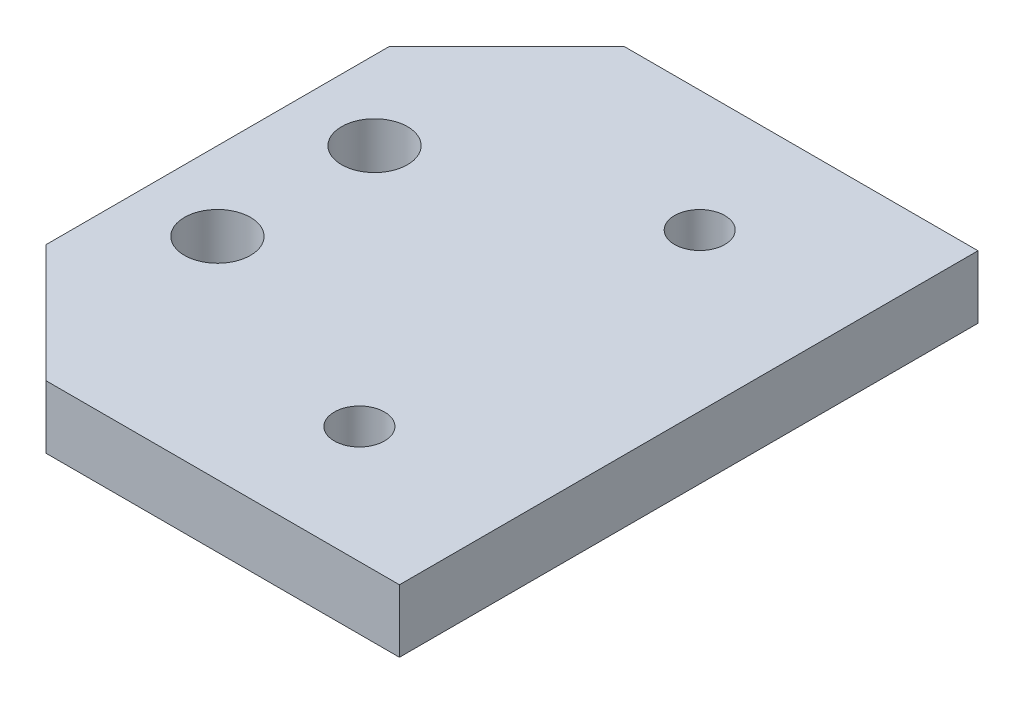
ISO-10303-21;
HEADER;
FILE_DESCRIPTION(('STEP AP214'),'2;1');
FILE_NAME('part.step','',(''),(''),'','','');
FILE_SCHEMA(('AUTOMOTIVE_DESIGN { 1 0 10303 214 1 1 1 1 }'));
ENDSEC;
DATA;
#1=APPLICATION_CONTEXT('core data for automotive mechanical design processes');
#2=APPLICATION_PROTOCOL_DEFINITION('international standard','automotive_design',2000,#1);
#3=PRODUCT_CONTEXT('',#1,'mechanical');
#4=PRODUCT('Part','Part','',(#3));
#5=PRODUCT_RELATED_PRODUCT_CATEGORY('part','',(#4));
#6=PRODUCT_DEFINITION_FORMATION('','',#4);
#7=PRODUCT_DEFINITION_CONTEXT('part definition',#1,'design');
#8=PRODUCT_DEFINITION('design','',#6,#7);
#9=PRODUCT_DEFINITION_SHAPE('','',#8);
#10=(LENGTH_UNIT() NAMED_UNIT(*) SI_UNIT(.MILLI.,.METRE.));
#11=(NAMED_UNIT(*) PLANE_ANGLE_UNIT() SI_UNIT($,.RADIAN.));
#12=(NAMED_UNIT(*) SI_UNIT($,.STERADIAN.) SOLID_ANGLE_UNIT());
#13=UNCERTAINTY_MEASURE_WITH_UNIT(LENGTH_MEASURE(1.E-05),#10,'distance_accuracy_value','');
#14=(GEOMETRIC_REPRESENTATION_CONTEXT(3) GLOBAL_UNCERTAINTY_ASSIGNED_CONTEXT((#13)) GLOBAL_UNIT_ASSIGNED_CONTEXT((#10,
#11,#12)) REPRESENTATION_CONTEXT('',''));
#15=CARTESIAN_POINT('',(0.,0.,0.));
#16=DIRECTION('',(0.,0.,1.));
#17=DIRECTION('',(1.,0.,0.));
#18=AXIS2_PLACEMENT_3D('',#15,#16,#17);
#19=CARTESIAN_POINT('',(0.,4.,0.));
#20=DIRECTION('',(0.,-1.,0.));
#21=DIRECTION('',(0.,0.,1.));
#22=AXIS2_PLACEMENT_3D('',#19,#20,#21);
#23=PLANE('',#22);
#24=CARTESIAN_POINT('',(20.,4.,29.3778251349138));
#25=DIRECTION('',(0.,-1.,0.));
#26=DIRECTION('',(0.,0.,-1.));
#27=AXIS2_PLACEMENT_3D('',#24,#25,#26);
#28=CIRCLE('',#27,1.6);
#29=CARTESIAN_POINT('',(20.,4.,27.7778251349138));
#30=VERTEX_POINT('',#29);
#31=EDGE_CURVE('E166',#30,#30,#28,.T.);
#32=ORIENTED_EDGE('',*,*,#31,.T.);
#33=EDGE_LOOP('',(#32));
#34=FACE_BOUND('',#33,.T.);
#35=CARTESIAN_POINT('',(20.,4.,7.71633932616848));
#36=DIRECTION('',(0.,-1.,0.));
#37=DIRECTION('',(0.,0.,-1.));
#38=AXIS2_PLACEMENT_3D('',#35,#36,#37);
#39=CIRCLE('',#38,1.6);
#40=CARTESIAN_POINT('',(20.,4.,6.11633932616848));
#41=VERTEX_POINT('',#40);
#42=EDGE_CURVE('E163',#41,#41,#39,.T.);
#43=ORIENTED_EDGE('',*,*,#42,.T.);
#44=EDGE_LOOP('',(#43));
#45=FACE_BOUND('',#44,.T.);
#46=DIRECTION('',(-1.,0.,0.));
#47=VECTOR('',#46,1.);
#48=CARTESIAN_POINT('',(0.,4.,36.83));
#49=LINE('',#48,#47);
#50=CARTESIAN_POINT('',(30.,4.,36.83));
#51=VERTEX_POINT('',#50);
#52=CARTESIAN_POINT('',(7.50000000000003,4.,36.83));
#53=VERTEX_POINT('',#52);
#54=EDGE_CURVE('E116',#51,#53,#49,.T.);
#55=ORIENTED_EDGE('',*,*,#54,.F.);
#56=DIRECTION('',(0.,0.,1.));
#57=VECTOR('',#56,1.);
#58=CARTESIAN_POINT('',(30.,4.,0.));
#59=LINE('',#58,#57);
#60=CARTESIAN_POINT('',(30.,4.,0.));
#61=VERTEX_POINT('',#60);
#62=EDGE_CURVE('E99',#61,#51,#59,.T.);
#63=ORIENTED_EDGE('',*,*,#62,.F.);
#64=DIRECTION('',(1.,0.,0.));
#65=VECTOR('',#64,1.);
#66=CARTESIAN_POINT('',(0.,4.,0.));
#67=LINE('',#66,#65);
#68=CARTESIAN_POINT('',(7.50000000000001,4.,0.));
#69=VERTEX_POINT('',#68);
#70=EDGE_CURVE('E108',#69,#61,#67,.T.);
#71=ORIENTED_EDGE('',*,*,#70,.F.);
#72=DIRECTION('',(-0.707106781186547,0.,0.707106781186549));
#73=VECTOR('',#72,1.);
#74=CARTESIAN_POINT('',(7.50000000000001,4.,0.));
#75=LINE('',#74,#73);
#76=CARTESIAN_POINT('',(0.,4.,7.50000000000003));
#77=VERTEX_POINT('',#76);
#78=EDGE_CURVE('E141',#77,#69,#75,.F.);
#79=ORIENTED_EDGE('',*,*,#78,.F.);
#80=DIRECTION('',(0.,0.,-1.));
#81=VECTOR('',#80,1.);
#82=CARTESIAN_POINT('',(0.,4.,0.));
#83=LINE('',#82,#81);
#84=CARTESIAN_POINT('',(0.,4.,29.33));
#85=VERTEX_POINT('',#84);
#86=EDGE_CURVE('E112',#85,#77,#83,.T.);
#87=ORIENTED_EDGE('',*,*,#86,.F.);
#88=DIRECTION('',(0.707106781186549,0.,0.707106781186546));
#89=VECTOR('',#88,1.);
#90=CARTESIAN_POINT('',(0.,4.,29.33));
#91=LINE('',#90,#89);
#92=EDGE_CURVE('E51',#53,#85,#91,.F.);
#93=ORIENTED_EDGE('',*,*,#92,.F.);
#94=EDGE_LOOP('',(#55,#63,#71,#79,#87,#93));
#95=FACE_BOUND('',#94,.T.);
#96=CARTESIAN_POINT('',(5.,4.,23.415));
#97=DIRECTION('',(0.,-1.,0.));
#98=DIRECTION('',(0.,0.,-1.));
#99=AXIS2_PLACEMENT_3D('',#96,#97,#98);
#100=CIRCLE('',#99,2.1);
#101=CARTESIAN_POINT('',(5.,4.,21.315));
#102=VERTEX_POINT('',#101);
#103=EDGE_CURVE('E125',#102,#102,#100,.T.);
#104=ORIENTED_EDGE('',*,*,#103,.T.);
#105=EDGE_LOOP('',(#104));
#106=FACE_BOUND('',#105,.T.);
#107=CARTESIAN_POINT('',(5.,4.,13.415));
#108=DIRECTION('',(0.,-1.,0.));
#109=DIRECTION('',(0.,0.,-1.));
#110=AXIS2_PLACEMENT_3D('',#107,#108,#109);
#111=CIRCLE('',#110,2.1);
#112=CARTESIAN_POINT('',(5.,4.,11.315));
#113=VERTEX_POINT('',#112);
#114=EDGE_CURVE('E151',#113,#113,#111,.T.);
#115=ORIENTED_EDGE('',*,*,#114,.T.);
#116=EDGE_LOOP('',(#115));
#117=FACE_BOUND('',#116,.T.);
#118=ADVANCED_FACE('F43',(#34,#45,#95,#106,#117),#23,.F.);
#119=CARTESIAN_POINT('',(0.,0.,0.));
#120=DIRECTION('',(0.,-1.,0.));
#121=DIRECTION('',(0.,0.,1.));
#122=AXIS2_PLACEMENT_3D('',#119,#120,#121);
#123=PLANE('',#122);
#124=CARTESIAN_POINT('',(20.,0.,29.3778251349138));
#125=DIRECTION('',(0.,-1.,0.));
#126=DIRECTION('',(0.,0.,-1.));
#127=AXIS2_PLACEMENT_3D('',#124,#125,#126);
#128=CIRCLE('',#127,1.6);
#129=CARTESIAN_POINT('',(20.,0.,27.7778251349138));
#130=VERTEX_POINT('',#129);
#131=EDGE_CURVE('E157',#130,#130,#128,.T.);
#132=ORIENTED_EDGE('',*,*,#131,.F.);
#133=EDGE_LOOP('',(#132));
#134=FACE_BOUND('',#133,.T.);
#135=CARTESIAN_POINT('',(20.,0.,7.71633932616848));
#136=DIRECTION('',(0.,-1.,0.));
#137=DIRECTION('',(0.,0.,-1.));
#138=AXIS2_PLACEMENT_3D('',#135,#136,#137);
#139=CIRCLE('',#138,1.6);
#140=CARTESIAN_POINT('',(20.,0.,6.11633932616848));
#141=VERTEX_POINT('',#140);
#142=EDGE_CURVE('E160',#141,#141,#139,.T.);
#143=ORIENTED_EDGE('',*,*,#142,.F.);
#144=EDGE_LOOP('',(#143));
#145=FACE_BOUND('',#144,.T.);
#146=CARTESIAN_POINT('',(5.,0.,23.415));
#147=DIRECTION('',(0.,-1.,0.));
#148=DIRECTION('',(0.,0.,-1.));
#149=AXIS2_PLACEMENT_3D('',#146,#147,#148);
#150=CIRCLE('',#149,2.1);
#151=CARTESIAN_POINT('',(5.,0.,21.315));
#152=VERTEX_POINT('',#151);
#153=EDGE_CURVE('E148',#152,#152,#150,.T.);
#154=ORIENTED_EDGE('',*,*,#153,.F.);
#155=EDGE_LOOP('',(#154));
#156=FACE_BOUND('',#155,.T.);
#157=DIRECTION('',(0.,0.,-1.));
#158=VECTOR('',#157,1.);
#159=CARTESIAN_POINT('',(0.,0.,0.));
#160=LINE('',#159,#158);
#161=CARTESIAN_POINT('',(0.,0.,29.33));
#162=VERTEX_POINT('',#161);
#163=CARTESIAN_POINT('',(0.,0.,7.50000000000003));
#164=VERTEX_POINT('',#163);
#165=EDGE_CURVE('E121',#162,#164,#160,.T.);
#166=ORIENTED_EDGE('',*,*,#165,.T.);
#167=DIRECTION('',(0.707106781186547,0.,-0.707106781186549));
#168=VECTOR('',#167,1.);
#169=CARTESIAN_POINT('',(3.75000000000001,0.,3.75));
#170=LINE('',#169,#168);
#171=CARTESIAN_POINT('',(7.50000000000001,0.,0.));
#172=VERTEX_POINT('',#171);
#173=EDGE_CURVE('E135',#172,#164,#170,.F.);
#174=ORIENTED_EDGE('',*,*,#173,.F.);
#175=DIRECTION('',(1.,0.,0.));
#176=VECTOR('',#175,1.);
#177=CARTESIAN_POINT('',(0.,0.,0.));
#178=LINE('',#177,#176);
#179=CARTESIAN_POINT('',(30.,0.,0.));
#180=VERTEX_POINT('',#179);
#181=EDGE_CURVE('E124',#172,#180,#178,.T.);
#182=ORIENTED_EDGE('',*,*,#181,.T.);
#183=DIRECTION('',(0.,0.,1.));
#184=VECTOR('',#183,1.);
#185=CARTESIAN_POINT('',(30.,0.,0.));
#186=LINE('',#185,#184);
#187=CARTESIAN_POINT('',(30.,0.,36.83));
#188=VERTEX_POINT('',#187);
#189=EDGE_CURVE('E102',#180,#188,#186,.T.);
#190=ORIENTED_EDGE('',*,*,#189,.T.);
#191=DIRECTION('',(-1.,0.,0.));
#192=VECTOR('',#191,1.);
#193=CARTESIAN_POINT('',(0.,0.,36.83));
#194=LINE('',#193,#192);
#195=CARTESIAN_POINT('',(7.50000000000003,0.,36.83));
#196=VERTEX_POINT('',#195);
#197=EDGE_CURVE('E128',#188,#196,#194,.T.);
#198=ORIENTED_EDGE('',*,*,#197,.T.);
#199=DIRECTION('',(-0.707106781186549,0.,-0.707106781186546));
#200=VECTOR('',#199,1.);
#201=CARTESIAN_POINT('',(-14.665,0.,14.6650000000001));
#202=LINE('',#201,#200);
#203=EDGE_CURVE('E138',#162,#196,#202,.F.);
#204=ORIENTED_EDGE('',*,*,#203,.F.);
#205=EDGE_LOOP('',(#166,#174,#182,#190,#198,#204));
#206=FACE_BOUND('',#205,.T.);
#207=CARTESIAN_POINT('',(5.,0.,13.415));
#208=DIRECTION('',(0.,-1.,0.));
#209=DIRECTION('',(0.,0.,-1.));
#210=AXIS2_PLACEMENT_3D('',#207,#208,#209);
#211=CIRCLE('',#210,2.1);
#212=CARTESIAN_POINT('',(5.,0.,11.315));
#213=VERTEX_POINT('',#212);
#214=EDGE_CURVE('E154',#213,#213,#211,.T.);
#215=ORIENTED_EDGE('',*,*,#214,.F.);
#216=EDGE_LOOP('',(#215));
#217=FACE_BOUND('',#216,.T.);
#218=ADVANCED_FACE('F175',(#134,#145,#156,#206,#217),#123,.T.);
#219=CARTESIAN_POINT('',(0.,4.,0.));
#220=DIRECTION('',(1.,0.,0.));
#221=DIRECTION('',(0.,0.,1.));
#222=AXIS2_PLACEMENT_3D('',#219,#220,#221);
#223=PLANE('',#222);
#224=ORIENTED_EDGE('',*,*,#86,.T.);
#225=DIRECTION('',(0.,1.,0.));
#226=VECTOR('',#225,1.);
#227=CARTESIAN_POINT('',(0.,4.,7.50000000000003));
#228=LINE('',#227,#226);
#229=EDGE_CURVE('E104',#164,#77,#228,.T.);
#230=ORIENTED_EDGE('',*,*,#229,.F.);
#231=ORIENTED_EDGE('',*,*,#165,.F.);
#232=DIRECTION('',(0.,-1.,0.));
#233=VECTOR('',#232,1.);
#234=CARTESIAN_POINT('',(0.,4.,29.33));
#235=LINE('',#234,#233);
#236=EDGE_CURVE('E133',#85,#162,#235,.T.);
#237=ORIENTED_EDGE('',*,*,#236,.F.);
#238=EDGE_LOOP('',(#224,#230,#231,#237));
#239=FACE_BOUND('',#238,.T.);
#240=ADVANCED_FACE('F178',(#239),#223,.F.);
#241=CARTESIAN_POINT('',(0.,4.,0.));
#242=DIRECTION('',(0.,0.,1.));
#243=DIRECTION('',(-1.,0.,0.));
#244=AXIS2_PLACEMENT_3D('',#241,#242,#243);
#245=PLANE('',#244);
#246=ORIENTED_EDGE('',*,*,#70,.T.);
#247=DIRECTION('',(0.,-1.,0.));
#248=VECTOR('',#247,1.);
#249=CARTESIAN_POINT('',(30.,4.,0.));
#250=LINE('',#249,#248);
#251=EDGE_CURVE('E96',#61,#180,#250,.T.);
#252=ORIENTED_EDGE('',*,*,#251,.T.);
#253=ORIENTED_EDGE('',*,*,#181,.F.);
#254=DIRECTION('',(0.,-1.,0.));
#255=VECTOR('',#254,1.);
#256=CARTESIAN_POINT('',(7.50000000000001,4.,0.));
#257=LINE('',#256,#255);
#258=EDGE_CURVE('E11',#69,#172,#257,.T.);
#259=ORIENTED_EDGE('',*,*,#258,.F.);
#260=EDGE_LOOP('',(#246,#252,#253,#259));
#261=FACE_BOUND('',#260,.T.);
#262=ADVANCED_FACE('F109',(#261),#245,.F.);
#263=CARTESIAN_POINT('',(30.,4.,0.));
#264=DIRECTION('',(-1.,0.,0.));
#265=DIRECTION('',(0.,0.,-1.));
#266=AXIS2_PLACEMENT_3D('',#263,#264,#265);
#267=PLANE('',#266);
#268=ORIENTED_EDGE('',*,*,#189,.F.);
#269=ORIENTED_EDGE('',*,*,#251,.F.);
#270=ORIENTED_EDGE('',*,*,#62,.T.);
#271=DIRECTION('',(0.,-1.,0.));
#272=VECTOR('',#271,1.);
#273=CARTESIAN_POINT('',(30.,4.,36.83));
#274=LINE('',#273,#272);
#275=EDGE_CURVE('E105',#51,#188,#274,.T.);
#276=ORIENTED_EDGE('',*,*,#275,.T.);
#277=EDGE_LOOP('',(#268,#269,#270,#276));
#278=FACE_BOUND('',#277,.T.);
#279=ADVANCED_FACE('F97',(#278),#267,.F.);
#280=CARTESIAN_POINT('',(0.,4.,36.83));
#281=DIRECTION('',(0.,0.,-1.));
#282=DIRECTION('',(1.,0.,0.));
#283=AXIS2_PLACEMENT_3D('',#280,#281,#282);
#284=PLANE('',#283);
#285=ORIENTED_EDGE('',*,*,#197,.F.);
#286=ORIENTED_EDGE('',*,*,#275,.F.);
#287=ORIENTED_EDGE('',*,*,#54,.T.);
#288=DIRECTION('',(0.,1.,0.));
#289=VECTOR('',#288,1.);
#290=CARTESIAN_POINT('',(7.50000000000003,4.,36.83));
#291=LINE('',#290,#289);
#292=EDGE_CURVE('E64',#196,#53,#291,.T.);
#293=ORIENTED_EDGE('',*,*,#292,.F.);
#294=EDGE_LOOP('',(#285,#286,#287,#293));
#295=FACE_BOUND('',#294,.T.);
#296=ADVANCED_FACE('F198',(#295),#284,.F.);
#297=CARTESIAN_POINT('',(5.,4.,23.415));
#298=DIRECTION('',(0.,-1.,0.));
#299=DIRECTION('',(0.,0.,1.));
#300=AXIS2_PLACEMENT_3D('',#297,#298,#299);
#301=CYLINDRICAL_SURFACE('',#300,2.1);
#302=ORIENTED_EDGE('',*,*,#103,.F.);
#303=EDGE_LOOP('',(#302));
#304=FACE_BOUND('',#303,.T.);
#305=ORIENTED_EDGE('',*,*,#153,.T.);
#306=EDGE_LOOP('',(#305));
#307=FACE_BOUND('',#306,.T.);
#308=ADVANCED_FACE('F191',(#304,#307),#301,.F.);
#309=CARTESIAN_POINT('',(5.,4.,13.415));
#310=DIRECTION('',(0.,-1.,0.));
#311=DIRECTION('',(0.,0.,1.));
#312=AXIS2_PLACEMENT_3D('',#309,#310,#311);
#313=CYLINDRICAL_SURFACE('',#312,2.1);
#314=ORIENTED_EDGE('',*,*,#114,.F.);
#315=EDGE_LOOP('',(#314));
#316=FACE_BOUND('',#315,.T.);
#317=ORIENTED_EDGE('',*,*,#214,.T.);
#318=EDGE_LOOP('',(#317));
#319=FACE_BOUND('',#318,.T.);
#320=ADVANCED_FACE('F189',(#316,#319),#313,.F.);
#321=CARTESIAN_POINT('',(0.,4.,29.33));
#322=DIRECTION('',(0.707106781186546,0.,-0.707106781186549));
#323=DIRECTION('',(0.,-1.,0.));
#324=AXIS2_PLACEMENT_3D('',#321,#322,#323);
#325=PLANE('',#324);
#326=ORIENTED_EDGE('',*,*,#92,.T.);
#327=ORIENTED_EDGE('',*,*,#236,.T.);
#328=ORIENTED_EDGE('',*,*,#203,.T.);
#329=ORIENTED_EDGE('',*,*,#292,.T.);
#330=EDGE_LOOP('',(#326,#327,#328,#329));
#331=FACE_BOUND('',#330,.T.);
#332=ADVANCED_FACE('F143',(#331),#325,.F.);
#333=CARTESIAN_POINT('',(7.50000000000001,4.,0.));
#334=DIRECTION('',(0.707106781186548,0.,0.707106781186546));
#335=DIRECTION('',(0.,-1.,0.));
#336=AXIS2_PLACEMENT_3D('',#333,#334,#335);
#337=PLANE('',#336);
#338=ORIENTED_EDGE('',*,*,#78,.T.);
#339=ORIENTED_EDGE('',*,*,#258,.T.);
#340=ORIENTED_EDGE('',*,*,#173,.T.);
#341=ORIENTED_EDGE('',*,*,#229,.T.);
#342=EDGE_LOOP('',(#338,#339,#340,#341));
#343=FACE_BOUND('',#342,.T.);
#344=ADVANCED_FACE('F45',(#343),#337,.F.);
#345=CARTESIAN_POINT('',(20.,0.,7.71633932616848));
#346=DIRECTION('',(0.,1.,0.));
#347=DIRECTION('',(0.,0.,-1.));
#348=AXIS2_PLACEMENT_3D('',#345,#346,#347);
#349=CYLINDRICAL_SURFACE('',#348,1.6);
#350=ORIENTED_EDGE('',*,*,#142,.T.);
#351=EDGE_LOOP('',(#350));
#352=FACE_BOUND('',#351,.T.);
#353=ORIENTED_EDGE('',*,*,#42,.F.);
#354=EDGE_LOOP('',(#353));
#355=FACE_BOUND('',#354,.T.);
#356=ADVANCED_FACE('F264',(#352,#355),#349,.F.);
#357=CARTESIAN_POINT('',(20.,0.,29.3778251349138));
#358=DIRECTION('',(0.,1.,0.));
#359=DIRECTION('',(0.,0.,-1.));
#360=AXIS2_PLACEMENT_3D('',#357,#358,#359);
#361=CYLINDRICAL_SURFACE('',#360,1.6);
#362=ORIENTED_EDGE('',*,*,#131,.T.);
#363=EDGE_LOOP('',(#362));
#364=FACE_BOUND('',#363,.T.);
#365=ORIENTED_EDGE('',*,*,#31,.F.);
#366=EDGE_LOOP('',(#365));
#367=FACE_BOUND('',#366,.T.);
#368=ADVANCED_FACE('F172',(#364,#367),#361,.F.);
#369=CLOSED_SHELL('',(#118,#218,#240,#262,#279,#296,#308,#320,#332,#344,#356,#368));
#370=MANIFOLD_SOLID_BREP('B2',#369);
#371=ADVANCED_BREP_SHAPE_REPRESENTATION('',(#18,#370),#14);
#372=SHAPE_DEFINITION_REPRESENTATION(#9,#371);
ENDSEC;
END-ISO-10303-21;
